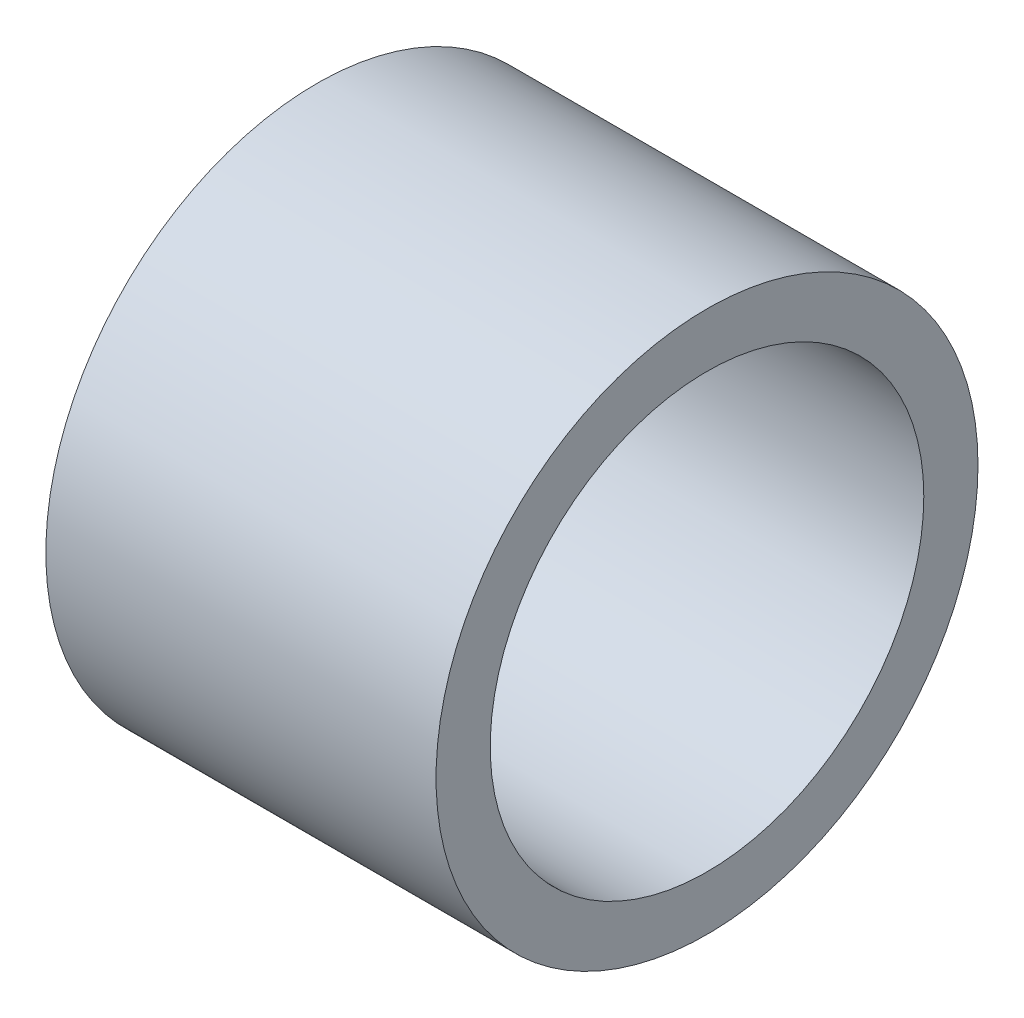
ISO-10303-21;
HEADER;
FILE_DESCRIPTION(('STEP AP214'),'2;1');
FILE_NAME('part.step','',(''),(''),'','','');
FILE_SCHEMA(('AUTOMOTIVE_DESIGN { 1 0 10303 214 1 1 1 1 }'));
ENDSEC;
DATA;
#1=APPLICATION_CONTEXT('core data for automotive mechanical design processes');
#2=APPLICATION_PROTOCOL_DEFINITION('international standard','automotive_design',2000,#1);
#3=PRODUCT_CONTEXT('',#1,'mechanical');
#4=PRODUCT('Part','Part','',(#3));
#5=PRODUCT_RELATED_PRODUCT_CATEGORY('part','',(#4));
#6=PRODUCT_DEFINITION_FORMATION('','',#4);
#7=PRODUCT_DEFINITION_CONTEXT('part definition',#1,'design');
#8=PRODUCT_DEFINITION('design','',#6,#7);
#9=PRODUCT_DEFINITION_SHAPE('','',#8);
#10=(LENGTH_UNIT() NAMED_UNIT(*) SI_UNIT(.MILLI.,.METRE.));
#11=(NAMED_UNIT(*) PLANE_ANGLE_UNIT() SI_UNIT($,.RADIAN.));
#12=(NAMED_UNIT(*) SI_UNIT($,.STERADIAN.) SOLID_ANGLE_UNIT());
#13=UNCERTAINTY_MEASURE_WITH_UNIT(LENGTH_MEASURE(1.E-05),#10,'distance_accuracy_value','');
#14=(GEOMETRIC_REPRESENTATION_CONTEXT(3) GLOBAL_UNCERTAINTY_ASSIGNED_CONTEXT((#13)) GLOBAL_UNIT_ASSIGNED_CONTEXT((#10,
#11,#12)) REPRESENTATION_CONTEXT('',''));
#15=CARTESIAN_POINT('',(0.,0.,0.));
#16=DIRECTION('',(0.,0.,1.));
#17=DIRECTION('',(1.,0.,0.));
#18=AXIS2_PLACEMENT_3D('',#15,#16,#17);
#19=CARTESIAN_POINT('',(11.43,0.,0.));
#20=DIRECTION('',(1.,0.,0.));
#21=DIRECTION('',(0.,0.,-1.));
#22=AXIS2_PLACEMENT_3D('',#19,#20,#21);
#23=PLANE('',#22);
#24=CARTESIAN_POINT('',(11.43,0.,0.));
#25=DIRECTION('',(1.,0.,0.));
#26=DIRECTION('',(0.,0.,-1.));
#27=AXIS2_PLACEMENT_3D('',#24,#25,#26);
#28=CIRCLE('',#27,7.9375);
#29=CARTESIAN_POINT('',(11.43,0.,-7.9375));
#30=VERTEX_POINT('',#29);
#31=EDGE_CURVE('E10',#30,#30,#28,.T.);
#32=ORIENTED_EDGE('',*,*,#31,.T.);
#33=EDGE_LOOP('',(#32));
#34=FACE_BOUND('',#33,.T.);
#35=CARTESIAN_POINT('',(11.43,0.,0.));
#36=DIRECTION('',(1.,0.,0.));
#37=DIRECTION('',(0.,0.,-1.));
#38=AXIS2_PLACEMENT_3D('',#35,#36,#37);
#39=CIRCLE('',#38,6.35);
#40=CARTESIAN_POINT('',(11.43,0.,-6.35));
#41=VERTEX_POINT('',#40);
#42=EDGE_CURVE('E52',#41,#41,#39,.T.);
#43=ORIENTED_EDGE('',*,*,#42,.F.);
#44=EDGE_LOOP('',(#43));
#45=FACE_BOUND('',#44,.T.);
#46=ADVANCED_FACE('F41',(#34,#45),#23,.T.);
#47=CARTESIAN_POINT('',(0.,0.,0.));
#48=DIRECTION('',(1.,0.,0.));
#49=DIRECTION('',(0.,0.,-1.));
#50=AXIS2_PLACEMENT_3D('',#47,#48,#49);
#51=PLANE('',#50);
#52=CARTESIAN_POINT('',(0.,0.,0.));
#53=DIRECTION('',(1.,0.,0.));
#54=DIRECTION('',(0.,0.,-1.));
#55=AXIS2_PLACEMENT_3D('',#52,#53,#54);
#56=CIRCLE('',#55,7.9375);
#57=CARTESIAN_POINT('',(0.,0.,-7.9375));
#58=VERTEX_POINT('',#57);
#59=EDGE_CURVE('E45',#58,#58,#56,.T.);
#60=ORIENTED_EDGE('',*,*,#59,.F.);
#61=EDGE_LOOP('',(#60));
#62=FACE_BOUND('',#61,.T.);
#63=CARTESIAN_POINT('',(0.,0.,0.));
#64=DIRECTION('',(1.,0.,0.));
#65=DIRECTION('',(0.,0.,-1.));
#66=AXIS2_PLACEMENT_3D('',#63,#64,#65);
#67=CIRCLE('',#66,6.35);
#68=CARTESIAN_POINT('',(0.,0.,-6.35));
#69=VERTEX_POINT('',#68);
#70=EDGE_CURVE('E54',#69,#69,#67,.T.);
#71=ORIENTED_EDGE('',*,*,#70,.T.);
#72=EDGE_LOOP('',(#71));
#73=FACE_BOUND('',#72,.T.);
#74=ADVANCED_FACE('F64',(#62,#73),#51,.F.);
#75=CARTESIAN_POINT('',(11.43,0.,0.));
#76=DIRECTION('',(-1.,0.,0.));
#77=DIRECTION('',(0.,0.,1.));
#78=AXIS2_PLACEMENT_3D('',#75,#76,#77);
#79=CYLINDRICAL_SURFACE('',#78,7.9375);
#80=ORIENTED_EDGE('',*,*,#31,.F.);
#81=EDGE_LOOP('',(#80));
#82=FACE_BOUND('',#81,.T.);
#83=ORIENTED_EDGE('',*,*,#59,.T.);
#84=EDGE_LOOP('',(#83));
#85=FACE_BOUND('',#84,.T.);
#86=ADVANCED_FACE('F43',(#82,#85),#79,.T.);
#87=CARTESIAN_POINT('',(11.43,0.,0.));
#88=DIRECTION('',(-1.,0.,0.));
#89=DIRECTION('',(0.,0.,1.));
#90=AXIS2_PLACEMENT_3D('',#87,#88,#89);
#91=CYLINDRICAL_SURFACE('',#90,6.35);
#92=ORIENTED_EDGE('',*,*,#42,.T.);
#93=EDGE_LOOP('',(#92));
#94=FACE_BOUND('',#93,.T.);
#95=ORIENTED_EDGE('',*,*,#70,.F.);
#96=EDGE_LOOP('',(#95));
#97=FACE_BOUND('',#96,.T.);
#98=ADVANCED_FACE('F60',(#94,#97),#91,.F.);
#99=CLOSED_SHELL('',(#46,#74,#86,#98));
#100=MANIFOLD_SOLID_BREP('B2',#99);
#101=ADVANCED_BREP_SHAPE_REPRESENTATION('',(#18,#100),#14);
#102=SHAPE_DEFINITION_REPRESENTATION(#9,#101);
ENDSEC;
END-ISO-10303-21;
